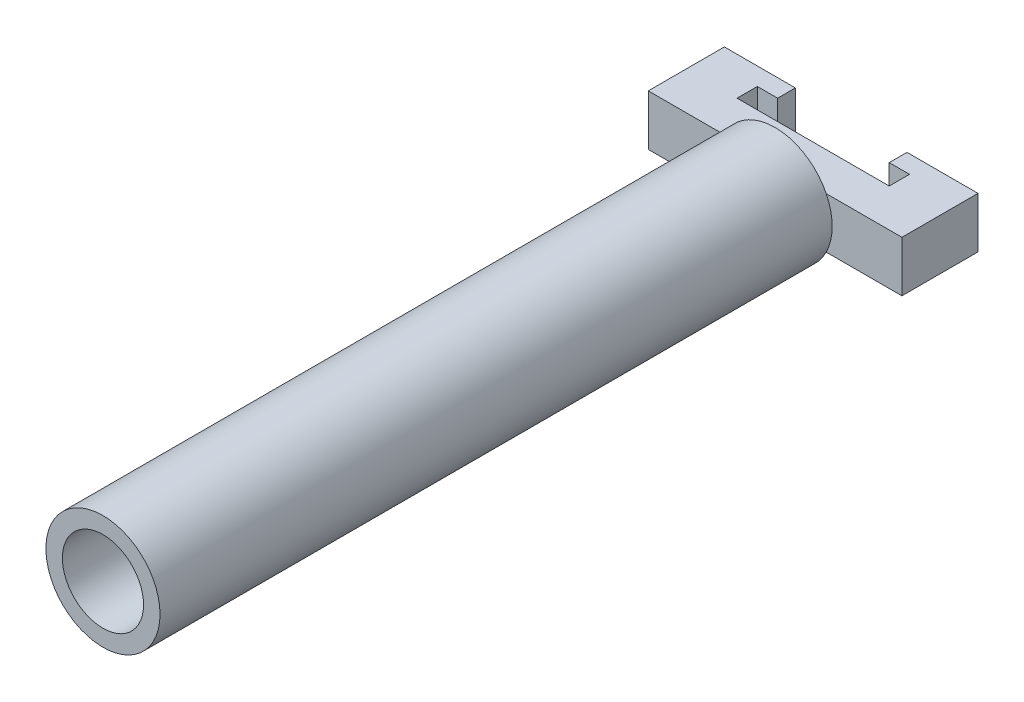
ISO-10303-21;
HEADER;
FILE_DESCRIPTION(('STEP AP214'),'2;1');
FILE_NAME('part.step','',(''),(''),'','','');
FILE_SCHEMA(('AUTOMOTIVE_DESIGN { 1 0 10303 214 1 1 1 1 }'));
ENDSEC;
DATA;
#1=APPLICATION_CONTEXT('core data for automotive mechanical design processes');
#2=APPLICATION_PROTOCOL_DEFINITION('international standard','automotive_design',2000,#1);
#3=PRODUCT_CONTEXT('',#1,'mechanical');
#4=PRODUCT('Part','Part','',(#3));
#5=PRODUCT_RELATED_PRODUCT_CATEGORY('part','',(#4));
#6=PRODUCT_DEFINITION_FORMATION('','',#4);
#7=PRODUCT_DEFINITION_CONTEXT('part definition',#1,'design');
#8=PRODUCT_DEFINITION('design','',#6,#7);
#9=PRODUCT_DEFINITION_SHAPE('','',#8);
#10=(LENGTH_UNIT() NAMED_UNIT(*) SI_UNIT(.MILLI.,.METRE.));
#11=(NAMED_UNIT(*) PLANE_ANGLE_UNIT() SI_UNIT($,.RADIAN.));
#12=(NAMED_UNIT(*) SI_UNIT($,.STERADIAN.) SOLID_ANGLE_UNIT());
#13=UNCERTAINTY_MEASURE_WITH_UNIT(LENGTH_MEASURE(1.E-05),#10,'distance_accuracy_value','');
#14=(GEOMETRIC_REPRESENTATION_CONTEXT(3) GLOBAL_UNCERTAINTY_ASSIGNED_CONTEXT((#13)) GLOBAL_UNIT_ASSIGNED_CONTEXT((#10,
#11,#12)) REPRESENTATION_CONTEXT('',''));
#15=CARTESIAN_POINT('',(0.,0.,0.));
#16=DIRECTION('',(0.,0.,1.));
#17=DIRECTION('',(1.,0.,0.));
#18=AXIS2_PLACEMENT_3D('',#15,#16,#17);
#19=CARTESIAN_POINT('',(0.,0.,-28.));
#20=DIRECTION('',(0.,0.,-1.));
#21=DIRECTION('',(-1.,0.,0.));
#22=AXIS2_PLACEMENT_3D('',#19,#20,#21);
#23=PLANE('',#22);
#24=DIRECTION('',(1.,0.,0.));
#25=VECTOR('',#24,1.);
#26=CARTESIAN_POINT('',(-5.,-0.999999999999999,-28.));
#27=LINE('',#26,#25);
#28=CARTESIAN_POINT('',(-3.,-0.999999999999999,-28.));
#29=VERTEX_POINT('',#28);
#30=CARTESIAN_POINT('',(3.,-1.,-28.));
#31=VERTEX_POINT('',#30);
#32=EDGE_CURVE('E57',#29,#31,#27,.T.);
#33=ORIENTED_EDGE('',*,*,#32,.F.);
#34=DIRECTION('',(0.,-1.,0.));
#35=VECTOR('',#34,1.);
#36=CARTESIAN_POINT('',(-3.,1.,-28.));
#37=LINE('',#36,#35);
#38=CARTESIAN_POINT('',(-3.,1.,-28.));
#39=VERTEX_POINT('',#38);
#40=EDGE_CURVE('E190',#39,#29,#37,.T.);
#41=ORIENTED_EDGE('',*,*,#40,.F.);
#42=DIRECTION('',(1.,0.,0.));
#43=VECTOR('',#42,1.);
#44=CARTESIAN_POINT('',(-5.,1.,-28.));
#45=LINE('',#44,#43);
#46=CARTESIAN_POINT('',(3.,1.,-28.));
#47=VERTEX_POINT('',#46);
#48=EDGE_CURVE('E211',#39,#47,#45,.T.);
#49=ORIENTED_EDGE('',*,*,#48,.T.);
#50=DIRECTION('',(0.,1.,0.));
#51=VECTOR('',#50,1.);
#52=CARTESIAN_POINT('',(3.,1.,-28.));
#53=LINE('',#52,#51);
#54=EDGE_CURVE('E198',#31,#47,#53,.T.);
#55=ORIENTED_EDGE('',*,*,#54,.F.);
#56=EDGE_LOOP('',(#33,#41,#49,#55));
#57=FACE_BOUND('',#56,.T.);
#58=ADVANCED_FACE('F33',(#57),#23,.T.);
#59=CARTESIAN_POINT('',(0.,0.,-26.5));
#60=DIRECTION('',(0.,0.,-1.));
#61=DIRECTION('',(-1.,0.,0.));
#62=AXIS2_PLACEMENT_3D('',#59,#60,#61);
#63=PLANE('',#62);
#64=CARTESIAN_POINT('',(0.,0.,-26.5));
#65=DIRECTION('',(0.,0.,-1.));
#66=DIRECTION('',(-1.,0.,0.));
#67=AXIS2_PLACEMENT_3D('',#64,#65,#66);
#68=CIRCLE('',#67,2.25);
#69=CARTESIAN_POINT('',(2.01556443707464,-1.,-26.5));
#70=VERTEX_POINT('',#69);
#71=CARTESIAN_POINT('',(-2.01556443707464,-0.999999999999999,-26.5));
#72=VERTEX_POINT('',#71);
#73=EDGE_CURVE('E305',#70,#72,#68,.T.);
#74=ORIENTED_EDGE('',*,*,#73,.T.);
#75=DIRECTION('',(1.,0.,0.));
#76=VECTOR('',#75,1.);
#77=CARTESIAN_POINT('',(-5.,-0.999999999999999,-26.5));
#78=LINE('',#77,#76);
#79=EDGE_CURVE('E11',#72,#70,#78,.T.);
#80=ORIENTED_EDGE('',*,*,#79,.T.);
#81=EDGE_LOOP('',(#74,#80));
#82=FACE_BOUND('',#81,.T.);
#83=ADVANCED_FACE('F307',(#82),#63,.T.);
#84=CARTESIAN_POINT('',(0.,0.,-25.));
#85=DIRECTION('',(0.,0.,1.));
#86=DIRECTION('',(1.,0.,0.));
#87=AXIS2_PLACEMENT_3D('',#84,#85,#86);
#88=CYLINDRICAL_SURFACE('',#87,2.25);
#89=CARTESIAN_POINT('',(0.,0.,0.));
#90=DIRECTION('',(0.,0.,1.));
#91=DIRECTION('',(1.,0.,0.));
#92=AXIS2_PLACEMENT_3D('',#89,#90,#91);
#93=CIRCLE('',#92,2.25);
#94=CARTESIAN_POINT('',(2.25,0.,0.));
#95=VERTEX_POINT('',#94);
#96=EDGE_CURVE('E37',#95,#95,#93,.T.);
#97=ORIENTED_EDGE('',*,*,#96,.F.);
#98=EDGE_LOOP('',(#97));
#99=FACE_BOUND('',#98,.T.);
#100=CARTESIAN_POINT('',(-2.01556443707464,1.,-26.5));
#101=VERTEX_POINT('',#100);
#102=CARTESIAN_POINT('',(2.01556443707464,1.,-26.5));
#103=VERTEX_POINT('',#102);
#104=EDGE_CURVE('E234',#101,#103,#68,.T.);
#105=ORIENTED_EDGE('',*,*,#104,.F.);
#106=EDGE_CURVE('E233',#72,#101,#68,.T.);
#107=ORIENTED_EDGE('',*,*,#106,.F.);
#108=ORIENTED_EDGE('',*,*,#73,.F.);
#109=EDGE_CURVE('E237',#103,#70,#68,.T.);
#110=ORIENTED_EDGE('',*,*,#109,.F.);
#111=EDGE_LOOP('',(#105,#107,#108,#110));
#112=FACE_BOUND('',#111,.T.);
#113=ADVANCED_FACE('F35',(#99,#112),#88,.T.);
#114=CARTESIAN_POINT('',(0.,0.,0.));
#115=DIRECTION('',(0.,0.,1.));
#116=DIRECTION('',(1.,0.,0.));
#117=AXIS2_PLACEMENT_3D('',#114,#115,#116);
#118=PLANE('',#117);
#119=CARTESIAN_POINT('',(0.,0.,0.));
#120=DIRECTION('',(0.,0.,1.));
#121=DIRECTION('',(1.,0.,0.));
#122=AXIS2_PLACEMENT_3D('',#119,#120,#121);
#123=CIRCLE('',#122,1.6);
#124=CARTESIAN_POINT('',(1.6,0.,0.));
#125=VERTEX_POINT('',#124);
#126=EDGE_CURVE('E236',#125,#125,#123,.T.);
#127=ORIENTED_EDGE('',*,*,#126,.F.);
#128=EDGE_LOOP('',(#127));
#129=FACE_BOUND('',#128,.T.);
#130=ORIENTED_EDGE('',*,*,#96,.T.);
#131=EDGE_LOOP('',(#130));
#132=FACE_BOUND('',#131,.T.);
#133=ADVANCED_FACE('F245',(#129,#132),#118,.T.);
#134=CARTESIAN_POINT('',(0.,0.,-25.));
#135=DIRECTION('',(0.,0.,1.));
#136=DIRECTION('',(1.,0.,0.));
#137=AXIS2_PLACEMENT_3D('',#134,#135,#136);
#138=CYLINDRICAL_SURFACE('',#137,1.6);
#139=CARTESIAN_POINT('',(0.,0.,-25.));
#140=DIRECTION('',(0.,0.,1.));
#141=DIRECTION('',(1.,0.,0.));
#142=AXIS2_PLACEMENT_3D('',#139,#140,#141);
#143=CIRCLE('',#142,1.6);
#144=CARTESIAN_POINT('',(1.6,0.,-25.));
#145=VERTEX_POINT('',#144);
#146=EDGE_CURVE('E238',#145,#145,#143,.T.);
#147=ORIENTED_EDGE('',*,*,#146,.F.);
#148=EDGE_LOOP('',(#147));
#149=FACE_BOUND('',#148,.T.);
#150=ORIENTED_EDGE('',*,*,#126,.T.);
#151=EDGE_LOOP('',(#150));
#152=FACE_BOUND('',#151,.T.);
#153=ADVANCED_FACE('F243',(#149,#152),#138,.F.);
#154=CARTESIAN_POINT('',(0.,0.,-25.));
#155=DIRECTION('',(0.,0.,-1.));
#156=DIRECTION('',(-1.,0.,0.));
#157=AXIS2_PLACEMENT_3D('',#154,#155,#156);
#158=PLANE('',#157);
#159=ORIENTED_EDGE('',*,*,#146,.T.);
#160=EDGE_LOOP('',(#159));
#161=FACE_BOUND('',#160,.T.);
#162=ADVANCED_FACE('F311',(#161),#158,.F.);
#163=DIRECTION('',(1.,0.,0.));
#164=VECTOR('',#163,1.);
#165=CARTESIAN_POINT('',(-5.,1.,-26.5));
#166=LINE('',#165,#164);
#167=EDGE_CURVE('E42',#101,#103,#166,.T.);
#168=ORIENTED_EDGE('',*,*,#167,.F.);
#169=ORIENTED_EDGE('',*,*,#104,.T.);
#170=EDGE_LOOP('',(#168,#169));
#171=FACE_BOUND('',#170,.T.);
#172=ADVANCED_FACE('F309',(#171),#63,.T.);
#173=CARTESIAN_POINT('',(0.,0.,-26.5));
#174=DIRECTION('',(0.,0.,-1.));
#175=DIRECTION('',(-1.,0.,0.));
#176=AXIS2_PLACEMENT_3D('',#173,#174,#175);
#177=PLANE('',#176);
#178=CARTESIAN_POINT('',(5.,1.,-26.5));
#179=VERTEX_POINT('',#178);
#180=EDGE_CURVE('E217',#103,#179,#166,.T.);
#181=ORIENTED_EDGE('',*,*,#180,.F.);
#182=ORIENTED_EDGE('',*,*,#109,.T.);
#183=CARTESIAN_POINT('',(5.,-1.,-26.5));
#184=VERTEX_POINT('',#183);
#185=EDGE_CURVE('E45',#70,#184,#78,.T.);
#186=ORIENTED_EDGE('',*,*,#185,.T.);
#187=DIRECTION('',(0.,1.,0.));
#188=VECTOR('',#187,1.);
#189=CARTESIAN_POINT('',(5.,-1.,-26.5));
#190=LINE('',#189,#188);
#191=EDGE_CURVE('E220',#184,#179,#190,.T.);
#192=ORIENTED_EDGE('',*,*,#191,.T.);
#193=EDGE_LOOP('',(#181,#182,#186,#192));
#194=FACE_BOUND('',#193,.T.);
#195=ADVANCED_FACE('F260',(#194),#177,.F.);
#196=CARTESIAN_POINT('',(-5.,-0.999999999999999,-26.5));
#197=VERTEX_POINT('',#196);
#198=EDGE_CURVE('E44',#197,#72,#78,.T.);
#199=ORIENTED_EDGE('',*,*,#198,.T.);
#200=ORIENTED_EDGE('',*,*,#106,.T.);
#201=CARTESIAN_POINT('',(-5.,1.,-26.5));
#202=VERTEX_POINT('',#201);
#203=EDGE_CURVE('E218',#202,#101,#166,.T.);
#204=ORIENTED_EDGE('',*,*,#203,.F.);
#205=DIRECTION('',(0.,1.,0.));
#206=VECTOR('',#205,1.);
#207=CARTESIAN_POINT('',(-5.,-0.999999999999999,-26.5));
#208=LINE('',#207,#206);
#209=EDGE_CURVE('E210',#197,#202,#208,.T.);
#210=ORIENTED_EDGE('',*,*,#209,.F.);
#211=EDGE_LOOP('',(#199,#200,#204,#210));
#212=FACE_BOUND('',#211,.T.);
#213=ADVANCED_FACE('F300',(#212),#177,.F.);
#214=CARTESIAN_POINT('',(-5.,-0.999999999999999,-28.));
#215=DIRECTION('',(1.,0.,0.));
#216=DIRECTION('',(0.,0.,-1.));
#217=AXIS2_PLACEMENT_3D('',#214,#215,#216);
#218=PLANE('',#217);
#219=ORIENTED_EDGE('',*,*,#209,.T.);
#220=DIRECTION('',(0.,0.,1.));
#221=VECTOR('',#220,1.);
#222=CARTESIAN_POINT('',(-5.,1.,-28.));
#223=LINE('',#222,#221);
#224=CARTESIAN_POINT('',(-5.,1.,-29.5));
#225=VERTEX_POINT('',#224);
#226=EDGE_CURVE('E231',#225,#202,#223,.T.);
#227=ORIENTED_EDGE('',*,*,#226,.F.);
#228=DIRECTION('',(0.,1.,0.));
#229=VECTOR('',#228,1.);
#230=CARTESIAN_POINT('',(-5.,1.,-29.5));
#231=LINE('',#230,#229);
#232=CARTESIAN_POINT('',(-5.,-1.,-29.5));
#233=VERTEX_POINT('',#232);
#234=EDGE_CURVE('E153',#233,#225,#231,.T.);
#235=ORIENTED_EDGE('',*,*,#234,.F.);
#236=DIRECTION('',(0.,0.,1.));
#237=VECTOR('',#236,1.);
#238=CARTESIAN_POINT('',(-5.,-0.999999999999999,-28.));
#239=LINE('',#238,#237);
#240=EDGE_CURVE('E214',#233,#197,#239,.T.);
#241=ORIENTED_EDGE('',*,*,#240,.T.);
#242=EDGE_LOOP('',(#219,#227,#235,#241));
#243=FACE_BOUND('',#242,.T.);
#244=ADVANCED_FACE('F296',(#243),#218,.F.);
#245=CARTESIAN_POINT('',(-5.,1.,-28.));
#246=DIRECTION('',(0.,-1.,0.));
#247=DIRECTION('',(1.,0.,0.));
#248=AXIS2_PLACEMENT_3D('',#245,#246,#247);
#249=PLANE('',#248);
#250=ORIENTED_EDGE('',*,*,#203,.T.);
#251=ORIENTED_EDGE('',*,*,#167,.T.);
#252=ORIENTED_EDGE('',*,*,#180,.T.);
#253=DIRECTION('',(0.,0.,1.));
#254=VECTOR('',#253,1.);
#255=CARTESIAN_POINT('',(5.,1.,-28.));
#256=LINE('',#255,#254);
#257=CARTESIAN_POINT('',(5.,1.,-29.5));
#258=VERTEX_POINT('',#257);
#259=EDGE_CURVE('E228',#258,#179,#256,.T.);
#260=ORIENTED_EDGE('',*,*,#259,.F.);
#261=DIRECTION('',(1.,0.,0.));
#262=VECTOR('',#261,1.);
#263=CARTESIAN_POINT('',(5.,1.,-29.5));
#264=LINE('',#263,#262);
#265=CARTESIAN_POINT('',(2.2,1.,-29.5));
#266=VERTEX_POINT('',#265);
#267=EDGE_CURVE('E178',#266,#258,#264,.T.);
#268=ORIENTED_EDGE('',*,*,#267,.F.);
#269=DIRECTION('',(0.,0.,1.));
#270=VECTOR('',#269,1.);
#271=CARTESIAN_POINT('',(2.2,1.,-29.5));
#272=LINE('',#271,#270);
#273=CARTESIAN_POINT('',(2.2,1.,-28.8));
#274=VERTEX_POINT('',#273);
#275=EDGE_CURVE('E180',#266,#274,#272,.T.);
#276=ORIENTED_EDGE('',*,*,#275,.T.);
#277=DIRECTION('',(1.,0.,0.));
#278=VECTOR('',#277,1.);
#279=CARTESIAN_POINT('',(5.,1.,-28.8));
#280=LINE('',#279,#278);
#281=CARTESIAN_POINT('',(3.,1.,-28.8));
#282=VERTEX_POINT('',#281);
#283=EDGE_CURVE('E174',#274,#282,#280,.T.);
#284=ORIENTED_EDGE('',*,*,#283,.T.);
#285=DIRECTION('',(0.,0.,1.));
#286=VECTOR('',#285,1.);
#287=CARTESIAN_POINT('',(3.,1.,-28.8));
#288=LINE('',#287,#286);
#289=EDGE_CURVE('E202',#282,#47,#288,.T.);
#290=ORIENTED_EDGE('',*,*,#289,.T.);
#291=ORIENTED_EDGE('',*,*,#48,.F.);
#292=DIRECTION('',(0.,0.,1.));
#293=VECTOR('',#292,1.);
#294=CARTESIAN_POINT('',(-3.,1.,-28.8));
#295=LINE('',#294,#293);
#296=CARTESIAN_POINT('',(-3.,1.,-28.8));
#297=VERTEX_POINT('',#296);
#298=EDGE_CURVE('E196',#297,#39,#295,.T.);
#299=ORIENTED_EDGE('',*,*,#298,.F.);
#300=DIRECTION('',(1.,0.,0.));
#301=VECTOR('',#300,1.);
#302=CARTESIAN_POINT('',(-5.,1.,-28.8));
#303=LINE('',#302,#301);
#304=CARTESIAN_POINT('',(-2.2,1.,-28.8));
#305=VERTEX_POINT('',#304);
#306=EDGE_CURVE('E161',#297,#305,#303,.T.);
#307=ORIENTED_EDGE('',*,*,#306,.T.);
#308=DIRECTION('',(0.,0.,1.));
#309=VECTOR('',#308,1.);
#310=CARTESIAN_POINT('',(-2.2,1.,-29.5));
#311=LINE('',#310,#309);
#312=CARTESIAN_POINT('',(-2.2,1.,-29.5));
#313=VERTEX_POINT('',#312);
#314=EDGE_CURVE('E140',#313,#305,#311,.T.);
#315=ORIENTED_EDGE('',*,*,#314,.F.);
#316=DIRECTION('',(1.,0.,0.));
#317=VECTOR('',#316,1.);
#318=CARTESIAN_POINT('',(-5.,1.,-29.5));
#319=LINE('',#318,#317);
#320=EDGE_CURVE('E147',#225,#313,#319,.T.);
#321=ORIENTED_EDGE('',*,*,#320,.F.);
#322=ORIENTED_EDGE('',*,*,#226,.T.);
#323=EDGE_LOOP('',(#250,#251,#252,#260,#268,#276,#284,#290,#291,#299,#307,#315,#321,#322));
#324=FACE_BOUND('',#323,.T.);
#325=ADVANCED_FACE('F159',(#324),#249,.F.);
#326=CARTESIAN_POINT('',(5.,-1.,-28.));
#327=DIRECTION('',(1.,0.,0.));
#328=DIRECTION('',(0.,0.,-1.));
#329=AXIS2_PLACEMENT_3D('',#326,#327,#328);
#330=PLANE('',#329);
#331=ORIENTED_EDGE('',*,*,#191,.F.);
#332=DIRECTION('',(0.,0.,1.));
#333=VECTOR('',#332,1.);
#334=CARTESIAN_POINT('',(5.,-1.,-28.));
#335=LINE('',#334,#333);
#336=CARTESIAN_POINT('',(5.,-1.,-29.5));
#337=VERTEX_POINT('',#336);
#338=EDGE_CURVE('E225',#337,#184,#335,.T.);
#339=ORIENTED_EDGE('',*,*,#338,.F.);
#340=DIRECTION('',(0.,-1.,0.));
#341=VECTOR('',#340,1.);
#342=CARTESIAN_POINT('',(5.,1.,-29.5));
#343=LINE('',#342,#341);
#344=EDGE_CURVE('E170',#258,#337,#343,.T.);
#345=ORIENTED_EDGE('',*,*,#344,.F.);
#346=ORIENTED_EDGE('',*,*,#259,.T.);
#347=EDGE_LOOP('',(#331,#339,#345,#346));
#348=FACE_BOUND('',#347,.T.);
#349=ADVANCED_FACE('F259',(#348),#330,.T.);
#350=CARTESIAN_POINT('',(-5.,-0.999999999999999,-28.));
#351=DIRECTION('',(0.,-1.,0.));
#352=DIRECTION('',(1.,0.,0.));
#353=AXIS2_PLACEMENT_3D('',#350,#351,#352);
#354=PLANE('',#353);
#355=ORIENTED_EDGE('',*,*,#198,.F.);
#356=ORIENTED_EDGE('',*,*,#240,.F.);
#357=DIRECTION('',(-1.,0.,0.));
#358=VECTOR('',#357,1.);
#359=CARTESIAN_POINT('',(-5.,-1.,-29.5));
#360=LINE('',#359,#358);
#361=CARTESIAN_POINT('',(-2.2,-0.999999999999999,-29.5));
#362=VERTEX_POINT('',#361);
#363=EDGE_CURVE('E146',#362,#233,#360,.T.);
#364=ORIENTED_EDGE('',*,*,#363,.F.);
#365=DIRECTION('',(0.,0.,1.));
#366=VECTOR('',#365,1.);
#367=CARTESIAN_POINT('',(-2.2,-0.999999999999999,-29.5));
#368=LINE('',#367,#366);
#369=CARTESIAN_POINT('',(-2.2,-0.999999999999999,-28.8));
#370=VERTEX_POINT('',#369);
#371=EDGE_CURVE('E142',#362,#370,#368,.T.);
#372=ORIENTED_EDGE('',*,*,#371,.T.);
#373=DIRECTION('',(-1.,0.,0.));
#374=VECTOR('',#373,1.);
#375=CARTESIAN_POINT('',(-5.,-1.,-28.8));
#376=LINE('',#375,#374);
#377=CARTESIAN_POINT('',(-3.,-0.999999999999999,-28.8));
#378=VERTEX_POINT('',#377);
#379=EDGE_CURVE('E156',#370,#378,#376,.T.);
#380=ORIENTED_EDGE('',*,*,#379,.T.);
#381=DIRECTION('',(0.,0.,1.));
#382=VECTOR('',#381,1.);
#383=CARTESIAN_POINT('',(-3.,-0.999999999999999,-28.8));
#384=LINE('',#383,#382);
#385=EDGE_CURVE('E52',#378,#29,#384,.T.);
#386=ORIENTED_EDGE('',*,*,#385,.T.);
#387=ORIENTED_EDGE('',*,*,#32,.T.);
#388=DIRECTION('',(0.,0.,1.));
#389=VECTOR('',#388,1.);
#390=CARTESIAN_POINT('',(3.,-0.999999999999999,-28.8));
#391=LINE('',#390,#389);
#392=CARTESIAN_POINT('',(3.,-0.999999999999999,-28.8));
#393=VERTEX_POINT('',#392);
#394=EDGE_CURVE('E207',#393,#31,#391,.T.);
#395=ORIENTED_EDGE('',*,*,#394,.F.);
#396=DIRECTION('',(-1.,0.,0.));
#397=VECTOR('',#396,1.);
#398=CARTESIAN_POINT('',(5.,-1.,-28.8));
#399=LINE('',#398,#397);
#400=CARTESIAN_POINT('',(2.2,-0.999999999999999,-28.8));
#401=VERTEX_POINT('',#400);
#402=EDGE_CURVE('E163',#393,#401,#399,.T.);
#403=ORIENTED_EDGE('',*,*,#402,.T.);
#404=DIRECTION('',(0.,0.,1.));
#405=VECTOR('',#404,1.);
#406=CARTESIAN_POINT('',(2.2,-0.999999999999999,-29.5));
#407=LINE('',#406,#405);
#408=CARTESIAN_POINT('',(2.2,-0.999999999999999,-29.5));
#409=VERTEX_POINT('',#408);
#410=EDGE_CURVE('E187',#409,#401,#407,.T.);
#411=ORIENTED_EDGE('',*,*,#410,.F.);
#412=DIRECTION('',(-1.,0.,0.));
#413=VECTOR('',#412,1.);
#414=CARTESIAN_POINT('',(5.,-1.,-29.5));
#415=LINE('',#414,#413);
#416=EDGE_CURVE('E173',#337,#409,#415,.T.);
#417=ORIENTED_EDGE('',*,*,#416,.F.);
#418=ORIENTED_EDGE('',*,*,#338,.T.);
#419=ORIENTED_EDGE('',*,*,#185,.F.);
#420=ORIENTED_EDGE('',*,*,#79,.F.);
#421=EDGE_LOOP('',(#355,#356,#364,#372,#380,#386,#387,#395,#403,#411,#417,#418,#419,#420));
#422=FACE_BOUND('',#421,.T.);
#423=ADVANCED_FACE('F266',(#422),#354,.T.);
#424=CARTESIAN_POINT('',(3.,1.,-28.8));
#425=DIRECTION('',(1.,0.,0.));
#426=DIRECTION('',(0.,1.,0.));
#427=AXIS2_PLACEMENT_3D('',#424,#425,#426);
#428=PLANE('',#427);
#429=ORIENTED_EDGE('',*,*,#54,.T.);
#430=ORIENTED_EDGE('',*,*,#289,.F.);
#431=DIRECTION('',(0.,1.,0.));
#432=VECTOR('',#431,1.);
#433=CARTESIAN_POINT('',(3.,1.,-28.8));
#434=LINE('',#433,#432);
#435=EDGE_CURVE('E199',#393,#282,#434,.T.);
#436=ORIENTED_EDGE('',*,*,#435,.F.);
#437=ORIENTED_EDGE('',*,*,#394,.T.);
#438=EDGE_LOOP('',(#429,#430,#436,#437));
#439=FACE_BOUND('',#438,.T.);
#440=ADVANCED_FACE('F280',(#439),#428,.F.);
#441=CARTESIAN_POINT('',(-3.,1.,-28.8));
#442=DIRECTION('',(-1.,0.,0.));
#443=DIRECTION('',(0.,-1.,0.));
#444=AXIS2_PLACEMENT_3D('',#441,#442,#443);
#445=PLANE('',#444);
#446=ORIENTED_EDGE('',*,*,#40,.T.);
#447=ORIENTED_EDGE('',*,*,#385,.F.);
#448=DIRECTION('',(0.,-1.,0.));
#449=VECTOR('',#448,1.);
#450=CARTESIAN_POINT('',(-3.,1.,-28.8));
#451=LINE('',#450,#449);
#452=EDGE_CURVE('E191',#297,#378,#451,.T.);
#453=ORIENTED_EDGE('',*,*,#452,.F.);
#454=ORIENTED_EDGE('',*,*,#298,.T.);
#455=EDGE_LOOP('',(#446,#447,#453,#454));
#456=FACE_BOUND('',#455,.T.);
#457=ADVANCED_FACE('F286',(#456),#445,.F.);
#458=CARTESIAN_POINT('',(0.,0.,-28.8));
#459=DIRECTION('',(0.,0.,-1.));
#460=DIRECTION('',(-1.,0.,0.));
#461=AXIS2_PLACEMENT_3D('',#458,#459,#460);
#462=PLANE('',#461);
#463=ORIENTED_EDGE('',*,*,#402,.F.);
#464=ORIENTED_EDGE('',*,*,#435,.T.);
#465=ORIENTED_EDGE('',*,*,#283,.F.);
#466=DIRECTION('',(0.,1.,0.));
#467=VECTOR('',#466,1.);
#468=CARTESIAN_POINT('',(2.2,1.,-28.8));
#469=LINE('',#468,#467);
#470=EDGE_CURVE('E165',#401,#274,#469,.T.);
#471=ORIENTED_EDGE('',*,*,#470,.F.);
#472=EDGE_LOOP('',(#463,#464,#465,#471));
#473=FACE_BOUND('',#472,.T.);
#474=ADVANCED_FACE('F277',(#473),#462,.F.);
#475=CARTESIAN_POINT('',(2.2,1.,-29.5));
#476=DIRECTION('',(1.,0.,0.));
#477=DIRECTION('',(0.,1.,0.));
#478=AXIS2_PLACEMENT_3D('',#475,#476,#477);
#479=PLANE('',#478);
#480=ORIENTED_EDGE('',*,*,#470,.T.);
#481=ORIENTED_EDGE('',*,*,#275,.F.);
#482=DIRECTION('',(0.,1.,0.));
#483=VECTOR('',#482,1.);
#484=CARTESIAN_POINT('',(2.2,1.,-29.5));
#485=LINE('',#484,#483);
#486=EDGE_CURVE('E176',#409,#266,#485,.T.);
#487=ORIENTED_EDGE('',*,*,#486,.F.);
#488=ORIENTED_EDGE('',*,*,#410,.T.);
#489=EDGE_LOOP('',(#480,#481,#487,#488));
#490=FACE_BOUND('',#489,.T.);
#491=ADVANCED_FACE('F465',(#490),#479,.F.);
#492=CARTESIAN_POINT('',(0.,0.,-29.5));
#493=DIRECTION('',(0.,0.,-1.));
#494=DIRECTION('',(-1.,0.,0.));
#495=AXIS2_PLACEMENT_3D('',#492,#493,#494);
#496=PLANE('',#495);
#497=ORIENTED_EDGE('',*,*,#344,.T.);
#498=ORIENTED_EDGE('',*,*,#416,.T.);
#499=ORIENTED_EDGE('',*,*,#486,.T.);
#500=ORIENTED_EDGE('',*,*,#267,.T.);
#501=EDGE_LOOP('',(#497,#498,#499,#500));
#502=FACE_BOUND('',#501,.T.);
#503=ADVANCED_FACE('F270',(#502),#496,.T.);
#504=CARTESIAN_POINT('',(0.,0.,-28.8));
#505=DIRECTION('',(0.,0.,-1.));
#506=DIRECTION('',(-1.,0.,0.));
#507=AXIS2_PLACEMENT_3D('',#504,#505,#506);
#508=PLANE('',#507);
#509=ORIENTED_EDGE('',*,*,#306,.F.);
#510=ORIENTED_EDGE('',*,*,#452,.T.);
#511=ORIENTED_EDGE('',*,*,#379,.F.);
#512=DIRECTION('',(0.,-1.,0.));
#513=VECTOR('',#512,1.);
#514=CARTESIAN_POINT('',(-2.2,1.,-28.8));
#515=LINE('',#514,#513);
#516=EDGE_CURVE('E290',#305,#370,#515,.T.);
#517=ORIENTED_EDGE('',*,*,#516,.F.);
#518=EDGE_LOOP('',(#509,#510,#511,#517));
#519=FACE_BOUND('',#518,.T.);
#520=ADVANCED_FACE('F289',(#519),#508,.F.);
#521=CARTESIAN_POINT('',(-2.2,1.,-29.5));
#522=DIRECTION('',(-1.,0.,0.));
#523=DIRECTION('',(0.,-1.,0.));
#524=AXIS2_PLACEMENT_3D('',#521,#522,#523);
#525=PLANE('',#524);
#526=ORIENTED_EDGE('',*,*,#516,.T.);
#527=ORIENTED_EDGE('',*,*,#371,.F.);
#528=DIRECTION('',(0.,-1.,0.));
#529=VECTOR('',#528,1.);
#530=CARTESIAN_POINT('',(-2.2,1.,-29.5));
#531=LINE('',#530,#529);
#532=EDGE_CURVE('E136',#313,#362,#531,.T.);
#533=ORIENTED_EDGE('',*,*,#532,.F.);
#534=ORIENTED_EDGE('',*,*,#314,.T.);
#535=EDGE_LOOP('',(#526,#527,#533,#534));
#536=FACE_BOUND('',#535,.T.);
#537=ADVANCED_FACE('F138',(#536),#525,.F.);
#538=CARTESIAN_POINT('',(0.,0.,-29.5));
#539=DIRECTION('',(0.,0.,-1.));
#540=DIRECTION('',(-1.,0.,0.));
#541=AXIS2_PLACEMENT_3D('',#538,#539,#540);
#542=PLANE('',#541);
#543=ORIENTED_EDGE('',*,*,#320,.T.);
#544=ORIENTED_EDGE('',*,*,#532,.T.);
#545=ORIENTED_EDGE('',*,*,#363,.T.);
#546=ORIENTED_EDGE('',*,*,#234,.T.);
#547=EDGE_LOOP('',(#543,#544,#545,#546));
#548=FACE_BOUND('',#547,.T.);
#549=ADVANCED_FACE('F151',(#548),#542,.T.);
#550=CLOSED_SHELL('',(#58,#83,#113,#133,#153,#162,#172,#195,#213,#244,#325,#349,#423,#440,#457,
#474,#491,#503,#520,#537,#549));
#551=MANIFOLD_SOLID_BREP('B2',#550);
#552=ADVANCED_BREP_SHAPE_REPRESENTATION('',(#18,#551),#14);
#553=SHAPE_DEFINITION_REPRESENTATION(#9,#552);
ENDSEC;
END-ISO-10303-21;
